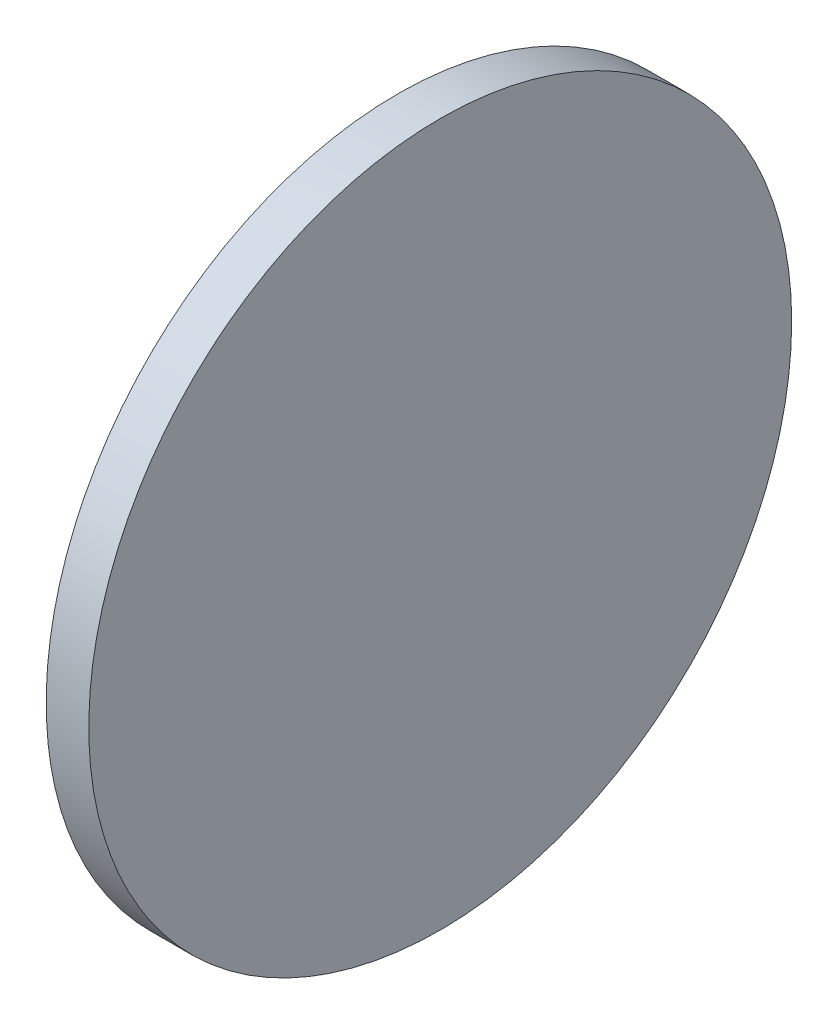
ISO-10303-21;
HEADER;
FILE_DESCRIPTION(('STEP AP214'),'2;1');
FILE_NAME('part.step','',(''),(''),'','','');
FILE_SCHEMA(('AUTOMOTIVE_DESIGN { 1 0 10303 214 1 1 1 1 }'));
ENDSEC;
DATA;
#1=APPLICATION_CONTEXT('core data for automotive mechanical design processes');
#2=APPLICATION_PROTOCOL_DEFINITION('international standard','automotive_design',2000,#1);
#3=PRODUCT_CONTEXT('',#1,'mechanical');
#4=PRODUCT('Part','Part','',(#3));
#5=PRODUCT_RELATED_PRODUCT_CATEGORY('part','',(#4));
#6=PRODUCT_DEFINITION_FORMATION('','',#4);
#7=PRODUCT_DEFINITION_CONTEXT('part definition',#1,'design');
#8=PRODUCT_DEFINITION('design','',#6,#7);
#9=PRODUCT_DEFINITION_SHAPE('','',#8);
#10=(LENGTH_UNIT() NAMED_UNIT(*) SI_UNIT(.MILLI.,.METRE.));
#11=(NAMED_UNIT(*) PLANE_ANGLE_UNIT() SI_UNIT($,.RADIAN.));
#12=(NAMED_UNIT(*) SI_UNIT($,.STERADIAN.) SOLID_ANGLE_UNIT());
#13=UNCERTAINTY_MEASURE_WITH_UNIT(LENGTH_MEASURE(1.E-05),#10,'distance_accuracy_value','');
#14=(GEOMETRIC_REPRESENTATION_CONTEXT(3) GLOBAL_UNCERTAINTY_ASSIGNED_CONTEXT((#13)) GLOBAL_UNIT_ASSIGNED_CONTEXT((#10,
#11,#12)) REPRESENTATION_CONTEXT('',''));
#15=CARTESIAN_POINT('',(0.,0.,0.));
#16=DIRECTION('',(0.,0.,1.));
#17=DIRECTION('',(1.,0.,0.));
#18=AXIS2_PLACEMENT_3D('',#15,#16,#17);
#19=CARTESIAN_POINT('',(376.792979828879,247.820822227896,369.071235745112));
#20=CARTESIAN_POINT('',(376.792979828879,249.16683202552,369.071235745112));
#21=CARTESIAN_POINT('',(376.792979828879,251.858851620768,369.336376532913));
#22=CARTESIAN_POINT('',(376.792979828879,255.741701808624,370.514226260344));
#23=CARTESIAN_POINT('',(376.792979828879,259.320157036274,372.426950429024));
#24=CARTESIAN_POINT('',(376.792979828879,262.456699276139,375.001044121819));
#25=CARTESIAN_POINT('',(376.792979828879,265.030792968934,378.137586361684));
#26=CARTESIAN_POINT('',(376.792979828879,266.943517137614,381.716041589333));
#27=CARTESIAN_POINT('',(376.792979828879,268.121366865045,385.59889177719));
#28=CARTESIAN_POINT('',(376.792979828879,268.519078046746,389.636921170062));
#29=CARTESIAN_POINT('',(376.792979828879,268.121366865045,393.674950562933));
#30=CARTESIAN_POINT('',(376.792979828879,266.943517137614,397.55780075079));
#31=CARTESIAN_POINT('',(376.792979828879,265.030792968934,401.136255978439));
#32=CARTESIAN_POINT('',(376.792979828879,262.456699276139,404.272798218304));
#33=CARTESIAN_POINT('',(376.792979828879,259.320157036274,406.846891911099));
#34=CARTESIAN_POINT('',(376.792979828879,255.741701808624,408.759616079779));
#35=CARTESIAN_POINT('',(376.792979828879,251.858851620768,409.93746580721));
#36=CARTESIAN_POINT('',(376.792979828879,247.820822227896,410.335176988911));
#37=CARTESIAN_POINT('',(376.792979828879,243.782792835025,409.93746580721));
#38=CARTESIAN_POINT('',(376.792979828879,239.899942647168,408.75961607978));
#39=CARTESIAN_POINT('',(376.792979828879,236.321487419519,406.846891911099));
#40=CARTESIAN_POINT('',(376.792979828879,233.184945179654,404.272798218304));
#41=CARTESIAN_POINT('',(376.792979828879,230.610851486859,401.136255978439));
#42=CARTESIAN_POINT('',(376.792979828879,228.698127318178,397.55780075079));
#43=CARTESIAN_POINT('',(376.792979828879,227.520277590748,393.674950562933));
#44=CARTESIAN_POINT('',(376.792979828879,227.122566409047,389.636921170061));
#45=CARTESIAN_POINT('',(376.792979828879,227.520277590748,385.59889177719));
#46=CARTESIAN_POINT('',(376.792979828879,228.698127318178,381.716041589333));
#47=CARTESIAN_POINT('',(376.792979828879,230.610851486859,378.137586361684));
#48=CARTESIAN_POINT('',(376.792979828879,233.184945179654,375.001044121819));
#49=CARTESIAN_POINT('',(376.792979828879,236.321487419519,372.426950429024));
#50=CARTESIAN_POINT('',(376.792979828879,239.899942647168,370.514226260344));
#51=CARTESIAN_POINT('',(376.792979828879,243.782792835025,369.336376532913));
#52=CARTESIAN_POINT('',(376.792979828879,246.474812430272,369.071235745112));
#53=CARTESIAN_POINT('',(376.792979828879,247.820822227896,369.071235745112));
#54=B_SPLINE_CURVE_WITH_KNOTS('',3,(#19,#20,#21,#22,#23,#24,#25,#26,#27,#28,#29,#30,#31,#32,#33,
#34,#35,#36,#37,#38,#39,#40,#41,#42,#43,#44,#45,#46,#47,#48,#49,#50,#51,#52,#53),.UNSPECIFIED.,
.T.,.F.,(4,1,1,1,1,1,1,1,1,1,1,1,1,1,1,1,1,1,1,1,1,1,1,1,1,1,1,1,1,1,1,1,4),(0.,
0.0312500000000002,0.0625000000000001,0.0937499999999997,0.125,0.15625,0.1875,0.21875,0.25,
0.28125,0.3125,0.34375,0.375,0.40625,0.4375,0.46875,0.5,0.53125,0.5625,0.59375,0.625,0.65625,
0.6875,0.71875,0.75,0.78125,0.8125,0.84375,0.875,0.90625,0.9375,0.96875,1.),.UNSPECIFIED.);
#55=DIRECTION('',(1.,0.,0.));
#56=VECTOR('',#55,1.);
#57=SURFACE_OF_LINEAR_EXTRUSION('',#54,#56);
#58=CARTESIAN_POINT('',(376.792979828879,247.820822227896,369.071235745112));
#59=CARTESIAN_POINT('',(376.792979828879,248.090025265433,369.071235758258));
#60=CARTESIAN_POINT('',(376.792979828879,248.359227126206,369.076538602103));
#61=CARTESIAN_POINT('',(376.792979828879,248.897217040621,369.097709095269));
#62=CARTESIAN_POINT('',(376.792979828879,249.166005091537,369.113576813913));
#63=CARTESIAN_POINT('',(376.792979828879,249.702753296032,369.155836271104));
#64=CARTESIAN_POINT('',(376.792979828879,249.97071344681,369.182228045224));
#65=CARTESIAN_POINT('',(376.792979828879,250.505392473979,369.245494954023));
#66=CARTESIAN_POINT('',(376.792979828879,250.772111354563,369.282370053265));
#67=CARTESIAN_POINT('',(376.792979828879,251.303894467433,369.366563035091));
#68=CARTESIAN_POINT('',(376.792979828879,251.568958710565,369.413880849151));
#69=CARTESIAN_POINT('',(376.792979828879,252.097018129299,369.518918398585));
#70=CARTESIAN_POINT('',(376.792979828879,252.3600133049,369.57663813396));
#71=CARTESIAN_POINT('',(376.792979828879,252.883536091862,369.702358545631));
#72=CARTESIAN_POINT('',(376.792979828879,253.14406368702,369.770359289386));
#73=CARTESIAN_POINT('',(376.792979828879,253.662253918709,369.916521102126));
#74=CARTESIAN_POINT('',(376.792979828879,253.919916545553,369.994682205454));
#75=CARTESIAN_POINT('',(376.792979828879,254.431979129106,370.161044167524));
#76=CARTESIAN_POINT('',(376.792979828879,254.686379096841,370.249244992326));
#77=CARTESIAN_POINT('',(376.792979828879,255.191518903522,370.435565966848));
#78=CARTESIAN_POINT('',(376.792979828879,255.442258766474,370.533686051475));
#79=CARTESIAN_POINT('',(376.792979828879,255.939679864039,370.739724616296));
#80=CARTESIAN_POINT('',(376.792979828879,256.186361098653,370.84764309649));
#81=CARTESIAN_POINT('',(376.792979828879,256.675297705972,371.073082054686));
#82=CARTESIAN_POINT('',(376.792979828879,256.917553049625,371.190602595691));
#83=CARTESIAN_POINT('',(376.792979828879,257.397271646333,371.435049849378));
#84=CARTESIAN_POINT('',(376.792979828879,257.634734883185,371.561976593854));
#85=CARTESIAN_POINT('',(376.792979828879,258.104502718993,371.825040411781));
#86=CARTESIAN_POINT('',(376.792979828879,258.336807335383,371.961177454096));
#87=CARTESIAN_POINT('',(376.792979828879,258.795891603413,372.242466210888));
#88=CARTESIAN_POINT('',(376.792979828879,259.022671291297,372.387617866206));
#89=CARTESIAN_POINT('',(376.792979828879,259.47033845199,372.686739499879));
#90=CARTESIAN_POINT('',(376.792979828879,259.691225924799,372.840709478234));
#91=CARTESIAN_POINT('',(376.792979828879,260.126786793359,373.15720349023));
#92=CARTESIAN_POINT('',(376.792979828879,260.341460148325,373.319727579995));
#93=CARTESIAN_POINT('',(376.792979828879,260.764271793273,373.653066303755));
#94=CARTESIAN_POINT('',(376.792979828879,260.972410061163,373.823880965772));
#95=CARTESIAN_POINT('',(376.792979828879,261.381830234779,374.173537244561));
#96=CARTESIAN_POINT('',(376.792979828879,261.583112163681,374.352378834199));
#97=CARTESIAN_POINT('',(376.792979828879,261.978498542088,374.717825604086));
#98=CARTESIAN_POINT('',(376.792979828879,262.172603038681,374.904430733384));
#99=CARTESIAN_POINT('',(376.792979828879,262.553312664573,375.285140359277));
#100=CARTESIAN_POINT('',(376.792979828879,262.739917793872,375.47924485587));
#101=CARTESIAN_POINT('',(376.792979828879,263.105364563759,375.874631234277));
#102=CARTESIAN_POINT('',(376.792979828879,263.284206153396,376.075913163178));
#103=CARTESIAN_POINT('',(376.792979828879,263.633862432186,376.485333336795));
#104=CARTESIAN_POINT('',(376.792979828879,263.804677094203,376.693471604685));
#105=CARTESIAN_POINT('',(376.792979828879,264.138015817963,377.116283249633));
#106=CARTESIAN_POINT('',(376.792979828879,264.300539907728,377.330956604599));
#107=CARTESIAN_POINT('',(376.792979828879,264.617033919724,377.766517473159));
#108=CARTESIAN_POINT('',(376.792979828879,264.771003898079,377.987404945968));
#109=CARTESIAN_POINT('',(376.792979828879,265.070125531752,378.435072106661));
#110=CARTESIAN_POINT('',(376.792979828879,265.21527718707,378.661851794545));
#111=CARTESIAN_POINT('',(376.792979828879,265.496565943862,379.120936062575));
#112=CARTESIAN_POINT('',(376.792979828879,265.632702986177,379.353240678965));
#113=CARTESIAN_POINT('',(376.792979828879,265.895766804104,379.823008514773));
#114=CARTESIAN_POINT('',(376.792979828879,266.02269354858,380.060471751625));
#115=CARTESIAN_POINT('',(376.792979828879,266.267140802267,380.540190348332));
#116=CARTESIAN_POINT('',(376.792979828879,266.384661343272,380.782445691985));
#117=CARTESIAN_POINT('',(376.792979828879,266.610100301468,381.271382299305));
#118=CARTESIAN_POINT('',(376.792979828879,266.718018781662,381.51806353392));
#119=CARTESIAN_POINT('',(376.792979828879,266.924057346483,382.015484631483));
#120=CARTESIAN_POINT('',(376.792979828879,267.02217743111,382.266224494431));
#121=CARTESIAN_POINT('',(376.792979828879,267.208498405632,382.771364301121));
#122=CARTESIAN_POINT('',(376.792979828879,267.296699230435,383.02576426887));
#123=CARTESIAN_POINT('',(376.792979828879,267.463061192503,383.537826852387));
#124=CARTESIAN_POINT('',(376.792979828879,267.541222295831,383.795489479182));
#125=CARTESIAN_POINT('',(376.792979828879,267.687384108573,384.313679711005));
#126=CARTESIAN_POINT('',(376.792979828879,267.755384852332,384.574207306347));
#127=CARTESIAN_POINT('',(376.792979828879,267.881105263993,385.097730092806));
#128=CARTESIAN_POINT('',(376.792979828879,267.938824999354,385.360725267721));
#129=CARTESIAN_POINT('',(376.792979828879,268.043862548825,385.888784688331));
#130=CARTESIAN_POINT('',(376.792979828879,268.091180362934,386.153848934027));
#131=CARTESIAN_POINT('',(376.792979828879,268.175373344625,386.685632039893));
#132=CARTESIAN_POINT('',(376.792979828879,268.212248443682,386.952350910908));
#133=CARTESIAN_POINT('',(376.792979828879,268.275515352987,387.487029964218));
#134=CARTESIAN_POINT('',(376.792979828879,268.301907127798,387.754990150706));
#135=CARTESIAN_POINT('',(376.792979828879,268.344166583101,388.291738257641));
#136=CARTESIAN_POINT('',(376.792979828879,268.360034299167,388.560526175289));
#137=CARTESIAN_POINT('',(376.792979828879,268.381204799377,389.098516453799));
#138=CARTESIAN_POINT('',(376.792979828879,268.386507652846,389.36771881193));
#139=CARTESIAN_POINT('',(376.792979828879,268.386507652846,389.906123528193));
#140=CARTESIAN_POINT('',(376.792979828879,268.381204799377,390.175325886324));
#141=CARTESIAN_POINT('',(376.792979828879,268.360034299167,390.713316164834));
#142=CARTESIAN_POINT('',(376.792979828879,268.344166583101,390.982104082481));
#143=CARTESIAN_POINT('',(376.792979828879,268.301907127798,391.518852189417));
#144=CARTESIAN_POINT('',(376.792979828879,268.275515352987,391.786812375905));
#145=CARTESIAN_POINT('',(376.792979828879,268.212248443682,392.321491429215));
#146=CARTESIAN_POINT('',(376.792979828879,268.175373344625,392.58821030023));
#147=CARTESIAN_POINT('',(376.792979828879,268.091180362934,393.119993406096));
#148=CARTESIAN_POINT('',(376.792979828879,268.043862548825,393.385057651792));
#149=CARTESIAN_POINT('',(376.792979828879,267.938824999354,393.913117072402));
#150=CARTESIAN_POINT('',(376.792979828879,267.881105263993,394.176112247317));
#151=CARTESIAN_POINT('',(376.792979828879,267.755384852332,394.699635033776));
#152=CARTESIAN_POINT('',(376.792979828879,267.687384108573,394.960162629118));
#153=CARTESIAN_POINT('',(376.792979828879,267.541222295831,395.478352860941));
#154=CARTESIAN_POINT('',(376.792979828879,267.463061192503,395.736015487736));
#155=CARTESIAN_POINT('',(376.792979828879,267.296699230435,396.248078071253));
#156=CARTESIAN_POINT('',(376.792979828879,267.208498405632,396.502478039002));
#157=CARTESIAN_POINT('',(376.792979828879,267.02217743111,397.007617845692));
#158=CARTESIAN_POINT('',(376.792979828879,266.924057346483,397.25835770864));
#159=CARTESIAN_POINT('',(376.792979828879,266.718018781662,397.755778806203));
#160=CARTESIAN_POINT('',(376.792979828879,266.610100301468,398.002460040818));
#161=CARTESIAN_POINT('',(376.792979828879,266.384661343272,398.491396648138));
#162=CARTESIAN_POINT('',(376.792979828879,266.267140802267,398.733651991791));
#163=CARTESIAN_POINT('',(376.792979828879,266.02269354858,399.213370588498));
#164=CARTESIAN_POINT('',(376.792979828879,265.895766804104,399.45083382535));
#165=CARTESIAN_POINT('',(376.792979828879,265.632702986177,399.920601661158));
#166=CARTESIAN_POINT('',(376.792979828879,265.496565943862,400.152906277548));
#167=CARTESIAN_POINT('',(376.792979828879,265.21527718707,400.611990545578));
#168=CARTESIAN_POINT('',(376.792979828879,265.070125531751,400.838770233462));
#169=CARTESIAN_POINT('',(376.792979828879,264.771003898078,401.286437394155));
#170=CARTESIAN_POINT('',(376.792979828879,264.617033919724,401.507324866964));
#171=CARTESIAN_POINT('',(376.792979828879,264.300539907728,401.942885735524));
#172=CARTESIAN_POINT('',(376.792979828879,264.138015817963,402.15755909049));
#173=CARTESIAN_POINT('',(376.792979828879,263.804677094203,402.580370735438));
#174=CARTESIAN_POINT('',(376.792979828879,263.633862432186,402.788509003328));
#175=CARTESIAN_POINT('',(376.792979828879,263.284206153397,403.197929176945));
#176=CARTESIAN_POINT('',(376.792979828879,263.105364563759,403.399211105846));
#177=CARTESIAN_POINT('',(376.792979828879,262.739917793872,403.794597484253));
#178=CARTESIAN_POINT('',(376.792979828879,262.553312664573,403.988701980846));
#179=CARTESIAN_POINT('',(376.792979828879,262.172603038681,404.369411606739));
#180=CARTESIAN_POINT('',(376.792979828879,261.978498542088,404.556016736037));
#181=CARTESIAN_POINT('',(376.792979828879,261.583112163681,404.921463505924));
#182=CARTESIAN_POINT('',(376.792979828879,261.38183023478,405.100305095562));
#183=CARTESIAN_POINT('',(376.792979828879,260.972410061163,405.449961374351));
#184=CARTESIAN_POINT('',(376.792979828879,260.764271793273,405.620776036368));
#185=CARTESIAN_POINT('',(376.792979828879,260.341460148325,405.954114760128));
#186=CARTESIAN_POINT('',(376.792979828879,260.126786793359,406.116638849893));
#187=CARTESIAN_POINT('',(376.792979828879,259.691225924799,406.43313286189));
#188=CARTESIAN_POINT('',(376.792979828879,259.47033845199,406.587102840244));
#189=CARTESIAN_POINT('',(376.792979828879,259.022671291297,406.886224473917));
#190=CARTESIAN_POINT('',(376.792979828879,258.795891603413,407.031376129235));
#191=CARTESIAN_POINT('',(376.792979828879,258.336807335383,407.312664886027));
#192=CARTESIAN_POINT('',(376.792979828879,258.104502718993,407.448801928342));
#193=CARTESIAN_POINT('',(376.792979828879,257.634734883185,407.711865746269));
#194=CARTESIAN_POINT('',(376.792979828879,257.397271646333,407.838792490745));
#195=CARTESIAN_POINT('',(376.792979828879,256.917553049625,408.083239744432));
#196=CARTESIAN_POINT('',(376.792979828879,256.675297705973,408.200760285437));
#197=CARTESIAN_POINT('',(376.792979828879,256.186361098653,408.426199243633));
#198=CARTESIAN_POINT('',(376.792979828879,255.939679864038,408.534117723827));
#199=CARTESIAN_POINT('',(376.792979828879,255.442258766475,408.740156288648));
#200=CARTESIAN_POINT('',(376.792979828879,255.191518903527,408.838276373275));
#201=CARTESIAN_POINT('',(376.792979828879,254.686379096837,409.024597347797));
#202=CARTESIAN_POINT('',(376.792979828879,254.431979129088,409.1127981726));
#203=CARTESIAN_POINT('',(376.792979828879,253.919916545571,409.279160134668));
#204=CARTESIAN_POINT('',(376.792979828879,253.662253918776,409.357321237996));
#205=CARTESIAN_POINT('',(376.792979828879,253.144063686953,409.503483050738));
#206=CARTESIAN_POINT('',(376.792979828879,252.883536091611,409.571483794497));
#207=CARTESIAN_POINT('',(376.792979828879,252.360013305152,409.697204206158));
#208=CARTESIAN_POINT('',(376.792979828879,252.097018130237,409.75492394152));
#209=CARTESIAN_POINT('',(376.792979828879,251.568958709627,409.85996149099));
#210=CARTESIAN_POINT('',(376.792979828879,251.303894463931,409.907279305099));
#211=CARTESIAN_POINT('',(376.792979828879,250.772111358065,409.99147228679));
#212=CARTESIAN_POINT('',(376.792979828879,250.50539248705,410.028347385847));
#213=CARTESIAN_POINT('',(376.792979828879,249.970713433739,410.091614295152));
#214=CARTESIAN_POINT('',(376.792979828879,249.702753247252,410.118006069963));
#215=CARTESIAN_POINT('',(376.792979828879,249.166005140316,410.160265525266));
#216=CARTESIAN_POINT('',(376.792979828879,248.897217222669,410.176133241332));
#217=CARTESIAN_POINT('',(376.792979828879,248.359226944159,410.197303741542));
#218=CARTESIAN_POINT('',(376.792979828879,248.090024586028,410.202606595011));
#219=CARTESIAN_POINT('',(376.792979828879,247.551619869765,410.202606595011));
#220=CARTESIAN_POINT('',(376.792979828879,247.282417511634,410.197303741542));
#221=CARTESIAN_POINT('',(376.792979828879,246.744427233124,410.176133241332));
#222=CARTESIAN_POINT('',(376.792979828879,246.475639315476,410.160265525266));
#223=CARTESIAN_POINT('',(376.792979828879,245.938891208541,410.118006069963));
#224=CARTESIAN_POINT('',(376.792979828879,245.670931022053,410.091614295152));
#225=CARTESIAN_POINT('',(376.792979828879,245.136251968743,410.028347385847));
#226=CARTESIAN_POINT('',(376.792979828879,244.869533097727,409.991472286791));
#227=CARTESIAN_POINT('',(376.792979828879,244.337749991862,409.9072793051));
#228=CARTESIAN_POINT('',(376.792979828879,244.072685746166,409.85996149099));
#229=CARTESIAN_POINT('',(376.792979828879,243.544626325556,409.75492394152));
#230=CARTESIAN_POINT('',(376.792979828879,243.281631150641,409.697204206158));
#231=CARTESIAN_POINT('',(376.792979828879,242.758108364182,409.571483794497));
#232=CARTESIAN_POINT('',(376.792979828879,242.49758076884,409.503483050738));
#233=CARTESIAN_POINT('',(376.792979828879,241.979390537017,409.357321237996));
#234=CARTESIAN_POINT('',(376.792979828879,241.721727910222,409.279160134668));
#235=CARTESIAN_POINT('',(376.792979828879,241.209665326705,409.1127981726));
#236=CARTESIAN_POINT('',(376.792979828879,240.955265358956,409.024597347797));
#237=CARTESIAN_POINT('',(376.792979828879,240.450125552266,408.838276373275));
#238=CARTESIAN_POINT('',(376.792979828879,240.199385689318,408.740156288648));
#239=CARTESIAN_POINT('',(376.792979828879,239.701964591755,408.534117723827));
#240=CARTESIAN_POINT('',(376.792979828879,239.45528335714,408.426199243633));
#241=CARTESIAN_POINT('',(376.792979828879,238.96634674982,408.200760285437));
#242=CARTESIAN_POINT('',(376.792979828879,238.724091406167,408.083239744432));
#243=CARTESIAN_POINT('',(376.792979828879,238.24437280946,407.838792490745));
#244=CARTESIAN_POINT('',(376.792979828879,238.006909572608,407.711865746269));
#245=CARTESIAN_POINT('',(376.792979828879,237.5371417368,407.448801928342));
#246=CARTESIAN_POINT('',(376.792979828879,237.30483712041,407.312664886027));
#247=CARTESIAN_POINT('',(376.792979828879,236.84575285238,407.031376129235));
#248=CARTESIAN_POINT('',(376.792979828879,236.618973164496,406.886224473917));
#249=CARTESIAN_POINT('',(376.792979828879,236.171306003803,406.587102840244));
#250=CARTESIAN_POINT('',(376.792979828879,235.950418530994,406.43313286189));
#251=CARTESIAN_POINT('',(376.792979828879,235.514857662434,406.116638849893));
#252=CARTESIAN_POINT('',(376.792979828879,235.300184307468,405.954114760128));
#253=CARTESIAN_POINT('',(376.792979828879,234.87737266252,405.620776036368));
#254=CARTESIAN_POINT('',(376.792979828879,234.66923439463,405.449961374351));
#255=CARTESIAN_POINT('',(376.792979828879,234.259814221013,405.100305095562));
#256=CARTESIAN_POINT('',(376.792979828879,234.058532292112,404.921463505924));
#257=CARTESIAN_POINT('',(376.792979828879,233.663145913705,404.556016736037));
#258=CARTESIAN_POINT('',(376.792979828879,233.469041417112,404.369411606739));
#259=CARTESIAN_POINT('',(376.792979828879,233.088331791219,403.988701980846));
#260=CARTESIAN_POINT('',(376.792979828879,232.90172666192,403.794597484253));
#261=CARTESIAN_POINT('',(376.792979828879,232.536279892033,403.399211105846));
#262=CARTESIAN_POINT('',(376.792979828879,232.357438302396,403.197929176945));
#263=CARTESIAN_POINT('',(376.792979828879,232.007782023607,402.788509003328));
#264=CARTESIAN_POINT('',(376.792979828879,231.83696736159,402.580370735438));
#265=CARTESIAN_POINT('',(376.792979828879,231.50362863783,402.15755909049));
#266=CARTESIAN_POINT('',(376.792979828879,231.341104548064,401.942885735524));
#267=CARTESIAN_POINT('',(376.792979828879,231.024610536068,401.507324866964));
#268=CARTESIAN_POINT('',(376.792979828879,230.870640557714,401.286437394155));
#269=CARTESIAN_POINT('',(376.792979828879,230.571518924041,400.838770233462));
#270=CARTESIAN_POINT('',(376.792979828879,230.426367268722,400.611990545578));
#271=CARTESIAN_POINT('',(376.792979828879,230.145078511931,400.152906277548));
#272=CARTESIAN_POINT('',(376.792979828879,230.008941469616,399.920601661158));
#273=CARTESIAN_POINT('',(376.792979828879,229.745877651689,399.45083382535));
#274=CARTESIAN_POINT('',(376.792979828879,229.618950907213,399.213370588498));
#275=CARTESIAN_POINT('',(376.792979828879,229.374503653526,398.733651991791));
#276=CARTESIAN_POINT('',(376.792979828879,229.256983112521,398.491396648138));
#277=CARTESIAN_POINT('',(376.792979828879,229.031544154325,398.002460040818));
#278=CARTESIAN_POINT('',(376.792979828879,228.923625674131,397.755778806203));
#279=CARTESIAN_POINT('',(376.792979828879,228.71758710931,397.25835770864));
#280=CARTESIAN_POINT('',(376.792979828879,228.619467024683,397.007617845692));
#281=CARTESIAN_POINT('',(376.792979828879,228.433146050161,396.502478039002));
#282=CARTESIAN_POINT('',(376.792979828879,228.344945225358,396.248078071253));
#283=CARTESIAN_POINT('',(376.792979828879,228.17858326329,395.736015487736));
#284=CARTESIAN_POINT('',(376.792979828879,228.100422159962,395.478352860941));
#285=CARTESIAN_POINT('',(376.792979828879,227.95426034722,394.960162629118));
#286=CARTESIAN_POINT('',(376.792979828879,227.886259603461,394.699635033776));
#287=CARTESIAN_POINT('',(376.792979828879,227.7605391918,394.176112247317));
#288=CARTESIAN_POINT('',(376.792979828879,227.702819456438,393.913117072402));
#289=CARTESIAN_POINT('',(376.792979828879,227.597781906968,393.385057651792));
#290=CARTESIAN_POINT('',(376.792979828879,227.550464092858,393.119993406096));
#291=CARTESIAN_POINT('',(376.792979828879,227.466271111167,392.588210300231));
#292=CARTESIAN_POINT('',(376.792979828879,227.429396012111,392.321491429215));
#293=CARTESIAN_POINT('',(376.792979828879,227.366129102806,391.786812375905));
#294=CARTESIAN_POINT('',(376.792979828879,227.339737327995,391.518852189417));
#295=CARTESIAN_POINT('',(376.792979828879,227.297477872692,390.982104082482));
#296=CARTESIAN_POINT('',(376.792979828879,227.281610156626,390.713316164834));
#297=CARTESIAN_POINT('',(376.792979828879,227.260439656416,390.175325886324));
#298=CARTESIAN_POINT('',(376.792979828879,227.255136802947,389.906123528193));
#299=CARTESIAN_POINT('',(376.792979828879,227.255136802947,389.36771881193));
#300=CARTESIAN_POINT('',(376.792979828879,227.260439656416,389.098516453799));
#301=CARTESIAN_POINT('',(376.792979828879,227.281610156626,388.560526175289));
#302=CARTESIAN_POINT('',(376.792979828879,227.297477872692,388.291738257641));
#303=CARTESIAN_POINT('',(376.792979828879,227.339737327995,387.754990150706));
#304=CARTESIAN_POINT('',(376.792979828879,227.366129102806,387.487029964218));
#305=CARTESIAN_POINT('',(376.792979828879,227.429396012111,386.952350910908));
#306=CARTESIAN_POINT('',(376.792979828879,227.466271111167,386.685632039893));
#307=CARTESIAN_POINT('',(376.792979828879,227.550464092858,386.153848934027));
#308=CARTESIAN_POINT('',(376.792979828879,227.597781906968,385.888784688331));
#309=CARTESIAN_POINT('',(376.792979828879,227.702819456438,385.360725267721));
#310=CARTESIAN_POINT('',(376.792979828879,227.7605391918,385.097730092806));
#311=CARTESIAN_POINT('',(376.792979828879,227.886259603461,384.574207306347));
#312=CARTESIAN_POINT('',(376.792979828879,227.95426034722,384.313679711005));
#313=CARTESIAN_POINT('',(376.792979828879,228.100422159962,383.795489479182));
#314=CARTESIAN_POINT('',(376.792979828879,228.17858326329,383.537826852387));
#315=CARTESIAN_POINT('',(376.792979828879,228.344945225358,383.02576426887));
#316=CARTESIAN_POINT('',(376.792979828879,228.433146050161,382.771364301121));
#317=CARTESIAN_POINT('',(376.792979828879,228.619467024683,382.266224494431));
#318=CARTESIAN_POINT('',(376.792979828879,228.71758710931,382.015484631483));
#319=CARTESIAN_POINT('',(376.792979828879,228.923625674131,381.51806353392));
#320=CARTESIAN_POINT('',(376.792979828879,229.031544154325,381.271382299305));
#321=CARTESIAN_POINT('',(376.792979828879,229.256983112521,380.782445691985));
#322=CARTESIAN_POINT('',(376.792979828879,229.374503653526,380.540190348332));
#323=CARTESIAN_POINT('',(376.792979828879,229.618950907212,380.060471751625));
#324=CARTESIAN_POINT('',(376.792979828879,229.745877651689,379.823008514773));
#325=CARTESIAN_POINT('',(376.792979828879,230.008941469616,379.353240678965));
#326=CARTESIAN_POINT('',(376.792979828879,230.14507851193,379.120936062575));
#327=CARTESIAN_POINT('',(376.792979828879,230.426367268722,378.661851794545));
#328=CARTESIAN_POINT('',(376.792979828879,230.571518924041,378.435072106661));
#329=CARTESIAN_POINT('',(376.792979828879,230.870640557714,377.987404945968));
#330=CARTESIAN_POINT('',(376.792979828879,231.024610536068,377.766517473159));
#331=CARTESIAN_POINT('',(376.792979828879,231.341104548064,377.330956604599));
#332=CARTESIAN_POINT('',(376.792979828879,231.50362863783,377.116283249633));
#333=CARTESIAN_POINT('',(376.792979828879,231.83696736159,376.693471604685));
#334=CARTESIAN_POINT('',(376.792979828879,232.007782023607,376.485333336795));
#335=CARTESIAN_POINT('',(376.792979828879,232.357438302396,376.075913163178));
#336=CARTESIAN_POINT('',(376.792979828879,232.536279892034,375.874631234277));
#337=CARTESIAN_POINT('',(376.792979828879,232.90172666192,375.47924485587));
#338=CARTESIAN_POINT('',(376.792979828879,233.088331791219,375.285140359277));
#339=CARTESIAN_POINT('',(376.792979828879,233.469041417112,374.904430733384));
#340=CARTESIAN_POINT('',(376.792979828879,233.663145913705,374.717825604086));
#341=CARTESIAN_POINT('',(376.792979828879,234.058532292112,374.352378834199));
#342=CARTESIAN_POINT('',(376.792979828879,234.259814221013,374.173537244561));
#343=CARTESIAN_POINT('',(376.792979828879,234.66923439463,373.823880965772));
#344=CARTESIAN_POINT('',(376.792979828879,234.87737266252,373.653066303755));
#345=CARTESIAN_POINT('',(376.792979828879,235.300184307468,373.319727579995));
#346=CARTESIAN_POINT('',(376.792979828879,235.514857662434,373.15720349023));
#347=CARTESIAN_POINT('',(376.792979828879,235.950418530994,372.840709478234));
#348=CARTESIAN_POINT('',(376.792979828879,236.171306003803,372.686739499879));
#349=CARTESIAN_POINT('',(376.792979828879,236.618973164496,372.387617866206));
#350=CARTESIAN_POINT('',(376.792979828879,236.84575285238,372.242466210888));
#351=CARTESIAN_POINT('',(376.792979828879,237.30483712041,371.961177454096));
#352=CARTESIAN_POINT('',(376.792979828879,237.5371417368,371.825040411781));
#353=CARTESIAN_POINT('',(376.792979828879,238.006909572607,371.561976593854));
#354=CARTESIAN_POINT('',(376.792979828879,238.24437280946,371.435049849378));
#355=CARTESIAN_POINT('',(376.792979828879,238.724091406167,371.190602595691));
#356=CARTESIAN_POINT('',(376.792979828879,238.96634674982,371.073082054686));
#357=CARTESIAN_POINT('',(376.792979828879,239.45528335714,370.84764309649));
#358=CARTESIAN_POINT('',(376.792979828879,239.701964591753,370.739724616296));
#359=CARTESIAN_POINT('',(376.792979828879,240.199385689319,370.533686051475));
#360=CARTESIAN_POINT('',(376.792979828879,240.45012555227,370.435565966848));
#361=CARTESIAN_POINT('',(376.792979828879,240.955265358951,370.249244992326));
#362=CARTESIAN_POINT('',(376.792979828879,241.209665326687,370.161044167524));
#363=CARTESIAN_POINT('',(376.792979828879,241.72172791024,369.994682205454));
#364=CARTESIAN_POINT('',(376.792979828879,241.979390537084,369.916521102126));
#365=CARTESIAN_POINT('',(376.792979828879,242.497580768773,369.770359289386));
#366=CARTESIAN_POINT('',(376.792979828879,242.75810836393,369.702358545631));
#367=CARTESIAN_POINT('',(376.792979828879,243.281631150893,369.57663813396));
#368=CARTESIAN_POINT('',(376.792979828879,243.544626326494,369.518918398585));
#369=CARTESIAN_POINT('',(376.792979828879,244.072685745227,369.413880849151));
#370=CARTESIAN_POINT('',(376.792979828879,244.337749988359,369.366563035091));
#371=CARTESIAN_POINT('',(376.792979828879,244.86953310123,369.282370053265));
#372=CARTESIAN_POINT('',(376.792979828879,245.136251981814,369.245494954023));
#373=CARTESIAN_POINT('',(376.792979828879,245.670931008983,369.182228045224));
#374=CARTESIAN_POINT('',(376.792979828879,245.938891159761,369.155836271104));
#375=CARTESIAN_POINT('',(376.792979828879,246.475639364256,369.113576813913));
#376=CARTESIAN_POINT('',(376.792979828879,246.744427415171,369.097709095269));
#377=CARTESIAN_POINT('',(376.792979828879,247.282417329587,369.076538602103));
#378=CARTESIAN_POINT('',(376.792979828879,247.55161919036,369.071235758258));
#379=CARTESIAN_POINT('',(376.792979828879,247.820822227896,369.071235745112));
#380=B_SPLINE_CURVE_WITH_KNOTS('',3,(#58,#59,#60,#61,#62,#63,#64,#65,#66,#67,#68,#69,#70,#71,
#72,#73,#74,#75,#76,#77,#78,#79,#80,#81,#82,#83,#84,#85,#86,#87,#88,#89,#90,#91,#92,#93,#94,#95,
#96,#97,#98,#99,#100,#101,#102,#103,#104,#105,#106,#107,#108,#109,#110,#111,#112,#113,#114,#115,
#116,#117,#118,#119,#120,#121,#122,#123,#124,#125,#126,#127,#128,#129,#130,#131,#132,#133,#134,
#135,#136,#137,#138,#139,#140,#141,#142,#143,#144,#145,#146,#147,#148,#149,#150,#151,#152,#153,
#154,#155,#156,#157,#158,#159,#160,#161,#162,#163,#164,#165,#166,#167,#168,#169,#170,#171,#172,
#173,#174,#175,#176,#177,#178,#179,#180,#181,#182,#183,#184,#185,#186,#187,#188,#189,#190,#191,
#192,#193,#194,#195,#196,#197,#198,#199,#200,#201,#202,#203,#204,#205,#206,#207,#208,#209,#210,
#211,#212,#213,#214,#215,#216,#217,#218,#219,#220,#221,#222,#223,#224,#225,#226,#227,#228,#229,
#230,#231,#232,#233,#234,#235,#236,#237,#238,#239,#240,#241,#242,#243,#244,#245,#246,#247,#248,
#249,#250,#251,#252,#253,#254,#255,#256,#257,#258,#259,#260,#261,#262,#263,#264,#265,#266,#267,
#268,#269,#270,#271,#272,#273,#274,#275,#276,#277,#278,#279,#280,#281,#282,#283,#284,#285,#286,
#287,#288,#289,#290,#291,#292,#293,#294,#295,#296,#297,#298,#299,#300,#301,#302,#303,#304,#305,
#306,#307,#308,#309,#310,#311,#312,#313,#314,#315,#316,#317,#318,#319,#320,#321,#322,#323,#324,
#325,#326,#327,#328,#329,#330,#331,#332,#333,#334,#335,#336,#337,#338,#339,#340,#341,#342,#343,
#344,#345,#346,#347,#348,#349,#350,#351,#352,#353,#354,#355,#356,#357,#358,#359,#360,#361,#362,
#363,#364,#365,#366,#367,#368,#369,#370,#371,#372,#373,#374,#375,#376,#377,#378,#379),
.UNSPECIFIED.,.F.,.F.,(4,2,2,2,2,2,2,2,2,2,2,2,2,2,2,2,2,2,2,2,2,2,2,2,2,2,2,2,2,2,2,2,2,2,2,2,
2,2,2,2,2,2,2,2,2,2,2,2,2,2,2,2,2,2,2,2,2,2,2,2,2,2,2,2,2,2,2,2,2,2,2,2,2,2,2,2,2,2,2,2,2,2,2,2,
2,2,2,2,2,2,2,2,2,2,2,2,2,2,2,2,2,2,2,2,2,2,2,2,2,2,2,2,2,2,2,2,2,2,2,2,2,2,2,2,2,2,2,2,2,2,2,2,
2,2,2,2,2,2,2,2,2,2,2,2,2,2,2,2,2,2,2,2,2,2,2,2,2,2,2,2,4),(0.,0.807555281253712,
1.61511586156481,2.42267917167975,3.23023975199085,4.03779503324463,4.84535031449834,
5.65291089480939,6.46047420492439,7.26803478523554,8.07559006648928,8.88314534774301,
9.69070592805421,10.4982692381692,11.3058298184803,12.1133850997339,12.9209403809877,
13.7285009612988,14.5360642714137,15.3436248517248,16.1511801329785,16.9587354142324,
17.7662959945434,18.5738593046584,19.3814198849695,20.1889751662234,20.996530447477,
21.8040910277881,22.6116543379032,23.4192149182142,24.2267701994679,25.0343254807217,
25.8418860610328,26.6494493711478,27.4570099514588,28.2645652327126,29.0721205139663,
29.8796810942775,30.6872444043924,31.4948049847035,32.3023602659573,33.109915547211,
33.9174761275221,34.7250394376371,35.5326000179482,36.340155299202,37.1477105804557,
37.9552711607668,38.7628344708818,39.5703950511929,40.3779503324467,41.1855056137004,
41.9930661940115,42.8006295041265,43.6081900844377,44.4157453656913,45.2233006469451,
46.0308612272562,46.8384245373711,47.6459851176823,48.4535403989359,49.2610956801897,
50.0686562605008,50.8762195706158,51.6837801509269,52.4913354321806,53.2988907134344,
54.1064512937455,54.9140146038605,55.7215751841715,56.5291304654253,57.336685746679,
58.1442463269901,58.9518096371052,59.7593702174162,60.56692549867,61.3744807799237,
62.1820413602348,62.9896046703498,63.7971652506609,64.6047205319146,65.4122758131684,
66.2198363934795,67.0273997035945,67.8349602839055,68.6425155651592,69.450070846413,
70.2576314267241,71.0651947368391,71.8727553171502,72.6803105984038,73.4878658796576,
74.2954264599687,75.1029897700837,75.9105503503949,76.7181056316487,77.5256609129024,
78.3332214932135,79.1407848033285,79.9483453836395,80.7559006648933,81.5634559461471,
82.3710165264581,83.1785798365731,83.9861404168842,84.793695698138,85.6012509793916,
86.4088115597027,87.2163748698178,88.0239354501289,88.8314907313826,89.6390460126363,
90.4466065929475,91.2541699030624,92.0617304833735,92.8692857646273,93.676841045881,
94.4844016261921,95.2919649363072,96.0995255166182,96.907080797872,97.7146360791257,
98.5221966594368,99.3297599695518,100.137320549863,100.944875831117,101.75243111237,
102.559991692681,103.367555002796,104.175115583108,104.982670864361,105.790226145615,
106.597786725926,107.405350036041,108.212910616352,109.020465897606,109.82802117886,
110.635581759171,111.443145069286,112.250705649597,113.058260930851,113.865816212104,
114.673376792415,115.48094010253,116.288500682841,117.096055964095,117.903611245349,
118.71117182566,119.518735135775,120.326295716086,121.13385099734,121.941406278594,
122.748966858905,123.55653016902,124.364090749331,125.171646030585,125.979201311838,
126.786761892149,127.594325202264,128.401885782576,129.209441063829),.UNSPECIFIED.);
#381=CARTESIAN_POINT('',(376.792979828879,247.820822227896,369.071235745112));
#382=VERTEX_POINT('',#381);
#383=EDGE_CURVE('E9',#382,#382,#380,.T.);
#384=ORIENTED_EDGE('',*,*,#383,.T.);
#385=EDGE_LOOP('',(#384));
#386=FACE_BOUND('',#385,.T.);
#387=CARTESIAN_POINT('',(379.284804762537,247.820822227896,369.071235745112));
#388=CARTESIAN_POINT('',(379.284804762537,247.49451495975,369.071235961153));
#389=CARTESIAN_POINT('',(379.284804762537,247.168209865213,369.079027009905));
#390=CARTESIAN_POINT('',(379.284804762537,246.516336621732,369.11011860062));
#391=CARTESIAN_POINT('',(379.284804762537,246.190768478437,369.133419261068));
#392=CARTESIAN_POINT('',(379.284804762537,245.541106539136,369.195457920313));
#393=CARTESIAN_POINT('',(379.284804762537,245.21701274406,369.234195928843));
#394=CARTESIAN_POINT('',(379.284804762537,244.571034544479,369.327034728814));
#395=CARTESIAN_POINT('',(379.284804762537,244.249150123764,369.381135407424));
#396=CARTESIAN_POINT('',(379.284804762537,243.608330211076,369.504635986474));
#397=CARTESIAN_POINT('',(379.284804762537,243.289394714028,369.574035860579));
#398=CARTESIAN_POINT('',(379.284804762537,242.655185426737,369.727932512786));
#399=CARTESIAN_POINT('',(379.284804762537,242.339911664619,369.812429406759));
#400=CARTESIAN_POINT('',(379.284804762537,241.713732996334,369.996302730044));
#401=CARTESIAN_POINT('',(379.284804762537,241.402828098366,370.095679187273));
#402=CARTESIAN_POINT('',(379.284804762537,240.786093665247,370.309094638198));
#403=CARTESIAN_POINT('',(379.284804762537,240.480264095482,370.423133531848));
#404=CARTESIAN_POINT('',(379.284804762537,239.874394524628,370.665671844156));
#405=CARTESIAN_POINT('',(379.284804762537,239.574354504206,370.794171214517));
#406=CARTESIAN_POINT('',(379.284804762537,238.980730752569,371.065309087617));
#407=CARTESIAN_POINT('',(379.284804762537,238.687147069252,371.207947695206));
#408=CARTESIAN_POINT('',(379.284804762537,238.107085626148,371.507009054397));
#409=CARTESIAN_POINT('',(379.284804762537,237.820607888228,371.66343184841));
#410=CARTESIAN_POINT('',(379.284804762537,237.255409184225,371.989711538643));
#411=CARTESIAN_POINT('',(379.284804762537,236.976688170797,372.159568352839));
#412=CARTESIAN_POINT('',(379.284804762537,236.427664356189,372.512379910978));
#413=CARTESIAN_POINT('',(379.284804762537,236.157361514851,372.695334592425));
#414=CARTESIAN_POINT('',(379.284804762537,235.625776655882,373.073913219307));
#415=CARTESIAN_POINT('',(379.284804762537,235.36449469998,373.269537251412));
#416=CARTESIAN_POINT('',(379.284804762537,234.8515173637,373.67297621099));
#417=CARTESIAN_POINT('',(379.284804762537,234.59982202361,373.880791189685));
#418=CARTESIAN_POINT('',(379.284804762537,234.106588768772,374.308142774532));
#419=CARTESIAN_POINT('',(379.284804762537,233.865050800994,374.527679319474));
#420=CARTESIAN_POINT('',(379.284804762537,233.39271426119,374.97801456741));
#421=CARTESIAN_POINT('',(379.284804762537,233.161915625244,375.208813203355));
#422=CARTESIAN_POINT('',(379.284804762537,232.711580377309,375.681149743159));
#423=CARTESIAN_POINT('',(379.284804762537,232.492043832367,375.922687710937));
#424=CARTESIAN_POINT('',(379.284804762537,232.06469224752,376.415920965775));
#425=CARTESIAN_POINT('',(379.284804762537,231.856877268825,376.667616305865));
#426=CARTESIAN_POINT('',(379.284804762537,231.453438309247,377.180593642145));
#427=CARTESIAN_POINT('',(379.284804762537,231.257814277142,377.441875598047));
#428=CARTESIAN_POINT('',(379.284804762537,230.879235650259,377.973460457017));
#429=CARTESIAN_POINT('',(379.284804762537,230.696280968813,378.243763298355));
#430=CARTESIAN_POINT('',(379.284804762537,230.343469410673,378.792787112962));
#431=CARTESIAN_POINT('',(379.284804762537,230.173612596478,379.07150812639));
#432=CARTESIAN_POINT('',(379.284804762537,229.847332906245,379.636706830394));
#433=CARTESIAN_POINT('',(379.284804762537,229.690910112232,379.923184568315));
#434=CARTESIAN_POINT('',(379.284804762537,229.391848753042,380.503246011415));
#435=CARTESIAN_POINT('',(379.284804762537,229.249210145453,380.796829694725));
#436=CARTESIAN_POINT('',(379.284804762537,228.97807227235,381.39045344638));
#437=CARTESIAN_POINT('',(379.284804762537,228.849572901985,381.690493466827));
#438=CARTESIAN_POINT('',(379.284804762537,228.607034589688,382.296363037614));
#439=CARTESIAN_POINT('',(379.284804762537,228.492995696054,382.602192607288));
#440=CARTESIAN_POINT('',(379.284804762537,228.279580245087,383.218927040655));
#441=CARTESIAN_POINT('',(379.284804762537,228.180203787799,383.529831938964));
#442=CARTESIAN_POINT('',(379.284804762537,227.996330464674,384.15601060632));
#443=CARTESIAN_POINT('',(379.284804762537,227.911833570919,384.471284367169));
#444=CARTESIAN_POINT('',(379.284804762537,227.757936918116,385.105493657926));
#445=CARTESIAN_POINT('',(379.284804762537,227.688537043196,385.42442915971));
#446=CARTESIAN_POINT('',(379.284804762537,227.565036466372,386.065249059461));
#447=CARTESIAN_POINT('',(379.284804762537,227.510935790805,386.387133462502));
#448=CARTESIAN_POINT('',(379.284804762537,227.418096982522,387.033111710368));
#449=CARTESIAN_POINT('',(379.284804762537,227.379358962637,387.357205571402));
#450=CARTESIAN_POINT('',(379.284804762537,227.317320334414,388.006867330501));
#451=CARTESIAN_POINT('',(379.284804762537,227.294019716344,388.332435227635));
#452=CARTESIAN_POINT('',(379.284804762537,227.262928009852,388.984309143639));
#453=CARTESIAN_POINT('',(379.284804762537,227.255136802947,389.31061515685));
#454=CARTESIAN_POINT('',(379.284804762537,227.255136802947,389.963227183273));
#455=CARTESIAN_POINT('',(379.284804762537,227.262928009852,390.289533196484));
#456=CARTESIAN_POINT('',(379.284804762537,227.294019716343,390.941407112488));
#457=CARTESIAN_POINT('',(379.284804762537,227.317320334414,391.266975009622));
#458=CARTESIAN_POINT('',(379.284804762537,227.379358962637,391.916636768721));
#459=CARTESIAN_POINT('',(379.284804762537,227.418096982522,392.240730629755));
#460=CARTESIAN_POINT('',(379.284804762537,227.510935790805,392.886708877622));
#461=CARTESIAN_POINT('',(379.284804762537,227.565036466372,393.208593280663));
#462=CARTESIAN_POINT('',(379.284804762537,227.688537043195,393.849413180413));
#463=CARTESIAN_POINT('',(379.284804762537,227.757936918116,394.168348682197));
#464=CARTESIAN_POINT('',(379.284804762537,227.911833570919,394.802557972954));
#465=CARTESIAN_POINT('',(379.284804762537,227.996330464674,395.117831733803));
#466=CARTESIAN_POINT('',(379.284804762537,228.180203787799,395.744010401159));
#467=CARTESIAN_POINT('',(379.284804762537,228.279580245087,396.054915299468));
#468=CARTESIAN_POINT('',(379.284804762537,228.492995696054,396.671649732836));
#469=CARTESIAN_POINT('',(379.284804762537,228.607034589688,396.977479302509));
#470=CARTESIAN_POINT('',(379.284804762537,228.849572901985,397.583348873296));
#471=CARTESIAN_POINT('',(379.284804762537,228.97807227235,397.883388893743));
#472=CARTESIAN_POINT('',(379.284804762537,229.249210145454,398.477012645398));
#473=CARTESIAN_POINT('',(379.284804762537,229.391848753042,398.770596328708));
#474=CARTESIAN_POINT('',(379.284804762537,229.690910112232,399.350657771808));
#475=CARTESIAN_POINT('',(379.284804762537,229.847332906245,399.637135509729));
#476=CARTESIAN_POINT('',(379.284804762537,230.173612596478,400.202334213733));
#477=CARTESIAN_POINT('',(379.284804762537,230.343469410673,400.481055227162));
#478=CARTESIAN_POINT('',(379.284804762537,230.696280968813,401.030079041768));
#479=CARTESIAN_POINT('',(379.284804762537,230.879235650259,401.300381883106));
#480=CARTESIAN_POINT('',(379.284804762537,231.257814277142,401.831966742076));
#481=CARTESIAN_POINT('',(379.284804762537,231.453438309247,402.093248697978));
#482=CARTESIAN_POINT('',(379.284804762537,231.856877268825,402.606226034258));
#483=CARTESIAN_POINT('',(379.284804762537,232.06469224752,402.857921374348));
#484=CARTESIAN_POINT('',(379.284804762537,232.492043832367,403.351154629186));
#485=CARTESIAN_POINT('',(379.284804762537,232.711580377309,403.592692596964));
#486=CARTESIAN_POINT('',(379.284804762537,233.161915625244,404.065029136768));
#487=CARTESIAN_POINT('',(379.284804762537,233.39271426119,404.295827772714));
#488=CARTESIAN_POINT('',(379.284804762537,233.865050800994,404.746163020649));
#489=CARTESIAN_POINT('',(379.284804762537,234.106588768772,404.965699565591));
#490=CARTESIAN_POINT('',(379.284804762537,234.59982202361,405.393051150438));
#491=CARTESIAN_POINT('',(379.284804762537,234.8515173637,405.600866129133));
#492=CARTESIAN_POINT('',(379.284804762537,235.36449469998,406.004305088711));
#493=CARTESIAN_POINT('',(379.284804762537,235.625776655882,406.199929120816));
#494=CARTESIAN_POINT('',(379.284804762537,236.157361514852,406.578507747699));
#495=CARTESIAN_POINT('',(379.284804762537,236.42766435619,406.761462429145));
#496=CARTESIAN_POINT('',(379.284804762537,236.976688170796,407.114273987284));
#497=CARTESIAN_POINT('',(379.284804762537,237.255409184225,407.28413080148));
#498=CARTESIAN_POINT('',(379.284804762537,237.820607888229,407.610410491713));
#499=CARTESIAN_POINT('',(379.284804762537,238.10708562615,407.766833285726));
#500=CARTESIAN_POINT('',(379.284804762537,238.68714706925,408.065894644916));
#501=CARTESIAN_POINT('',(379.284804762537,238.98073075256,408.208533252504));
#502=CARTESIAN_POINT('',(379.284804762537,239.574354504215,408.479671125608));
#503=CARTESIAN_POINT('',(379.284804762537,239.874394524661,408.608170495973));
#504=CARTESIAN_POINT('',(379.284804762537,240.480264095449,408.85070880827));
#505=CARTESIAN_POINT('',(379.284804762537,240.786093665122,408.964747701904));
#506=CARTESIAN_POINT('',(379.284804762537,241.40282809849,409.178163152871));
#507=CARTESIAN_POINT('',(379.284804762537,241.713732996799,409.277539610159));
#508=CARTESIAN_POINT('',(379.284804762537,242.339911664155,409.461412933284));
#509=CARTESIAN_POINT('',(379.284804762537,242.655185425004,409.545909827039));
#510=CARTESIAN_POINT('',(379.284804762537,243.289394715761,409.699806479842));
#511=CARTESIAN_POINT('',(379.284804762537,243.608330217545,409.769206354763));
#512=CARTESIAN_POINT('',(379.284804762537,244.249150117295,409.892706931586));
#513=CARTESIAN_POINT('',(379.284804762537,244.571034520336,409.946807607152));
#514=CARTESIAN_POINT('',(379.284804762537,245.217012768203,410.039646415436));
#515=CARTESIAN_POINT('',(379.284804762537,245.541106629237,410.078384435321));
#516=CARTESIAN_POINT('',(379.284804762537,246.190768388336,410.140423063544));
#517=CARTESIAN_POINT('',(379.284804762537,246.51633628547,410.163723681614));
#518=CARTESIAN_POINT('',(379.284804762537,247.168210201473,410.194815388106));
#519=CARTESIAN_POINT('',(379.284804762537,247.494516214685,410.202606595011));
#520=CARTESIAN_POINT('',(379.284804762537,248.147128241108,410.202606595011));
#521=CARTESIAN_POINT('',(379.284804762537,248.473434254319,410.194815388106));
#522=CARTESIAN_POINT('',(379.284804762537,249.125308170323,410.163723681614));
#523=CARTESIAN_POINT('',(379.284804762537,249.450876067457,410.140423063544));
#524=CARTESIAN_POINT('',(379.284804762537,250.100537826555,410.078384435321));
#525=CARTESIAN_POINT('',(379.284804762537,250.42463168759,410.039646415436));
#526=CARTESIAN_POINT('',(379.284804762537,251.070609935456,409.946807607152));
#527=CARTESIAN_POINT('',(379.284804762537,251.392494338497,409.892706931586));
#528=CARTESIAN_POINT('',(379.284804762537,252.033314238247,409.769206354762));
#529=CARTESIAN_POINT('',(379.284804762537,252.352249740032,409.699806479842));
#530=CARTESIAN_POINT('',(379.284804762537,252.986459030789,409.545909827039));
#531=CARTESIAN_POINT('',(379.284804762537,253.301732791638,409.461412933284));
#532=CARTESIAN_POINT('',(379.284804762537,253.927911458994,409.277539610159));
#533=CARTESIAN_POINT('',(379.284804762537,254.238816357302,409.178163152871));
#534=CARTESIAN_POINT('',(379.284804762537,254.85555079067,408.964747701904));
#535=CARTESIAN_POINT('',(379.284804762537,255.161380360344,408.850708808269));
#536=CARTESIAN_POINT('',(379.284804762537,255.767249931131,408.608170495973));
#537=CARTESIAN_POINT('',(379.284804762537,256.067289951578,408.479671125608));
#538=CARTESIAN_POINT('',(379.284804762537,256.660913703233,408.208533252504));
#539=CARTESIAN_POINT('',(379.284804762537,256.954497386543,408.065894644916));
#540=CARTESIAN_POINT('',(379.284804762537,257.534558829642,407.766833285726));
#541=CARTESIAN_POINT('',(379.284804762537,257.821036567564,407.610410491713));
#542=CARTESIAN_POINT('',(379.284804762537,258.386235271568,407.28413080148));
#543=CARTESIAN_POINT('',(379.284804762537,258.664956284996,407.114273987284));
#544=CARTESIAN_POINT('',(379.284804762537,259.213980099603,406.761462429145));
#545=CARTESIAN_POINT('',(379.284804762537,259.484282940941,406.578507747699));
#546=CARTESIAN_POINT('',(379.284804762537,260.015867799911,406.199929120816));
#547=CARTESIAN_POINT('',(379.284804762537,260.277149755813,406.004305088711));
#548=CARTESIAN_POINT('',(379.284804762537,260.790127092093,405.600866129133));
#549=CARTESIAN_POINT('',(379.284804762537,261.041822432183,405.393051150438));
#550=CARTESIAN_POINT('',(379.284804762537,261.535055687021,404.965699565591));
#551=CARTESIAN_POINT('',(379.284804762537,261.776593654799,404.746163020649));
#552=CARTESIAN_POINT('',(379.284804762537,262.248930194603,404.295827772714));
#553=CARTESIAN_POINT('',(379.284804762537,262.479728830548,404.065029136768));
#554=CARTESIAN_POINT('',(379.284804762537,262.930064078484,403.592692596964));
#555=CARTESIAN_POINT('',(379.284804762537,263.149600623425,403.351154629186));
#556=CARTESIAN_POINT('',(379.284804762537,263.576952208273,402.857921374348));
#557=CARTESIAN_POINT('',(379.284804762537,263.784767186968,402.606226034258));
#558=CARTESIAN_POINT('',(379.284804762537,264.188206146545,402.093248697978));
#559=CARTESIAN_POINT('',(379.284804762537,264.383830178651,401.831966742076));
#560=CARTESIAN_POINT('',(379.284804762537,264.762408805533,401.300381883106));
#561=CARTESIAN_POINT('',(379.284804762537,264.94536348698,401.030079041768));
#562=CARTESIAN_POINT('',(379.284804762537,265.298175045119,400.481055227162));
#563=CARTESIAN_POINT('',(379.284804762537,265.468031859315,400.202334213733));
#564=CARTESIAN_POINT('',(379.284804762537,265.794311549547,399.637135509729));
#565=CARTESIAN_POINT('',(379.284804762537,265.950734343561,399.350657771808));
#566=CARTESIAN_POINT('',(379.284804762537,266.249795702751,398.770596328708));
#567=CARTESIAN_POINT('',(379.284804762537,266.392434310339,398.477012645398));
#568=CARTESIAN_POINT('',(379.284804762537,266.663572183443,397.883388893743));
#569=CARTESIAN_POINT('',(379.284804762537,266.792071553808,397.583348873297));
#570=CARTESIAN_POINT('',(379.284804762537,267.034609866104,396.977479302509));
#571=CARTESIAN_POINT('',(379.284804762537,267.148648759739,396.671649732836));
#572=CARTESIAN_POINT('',(379.284804762537,267.362064210706,396.054915299468));
#573=CARTESIAN_POINT('',(379.284804762537,267.461440667994,395.744010401159));
#574=CARTESIAN_POINT('',(379.284804762537,267.645313991119,395.117831733803));
#575=CARTESIAN_POINT('',(379.284804762537,267.729810884874,394.802557972954));
#576=CARTESIAN_POINT('',(379.284804762537,267.883707537677,394.168348682197));
#577=CARTESIAN_POINT('',(379.284804762537,267.953107412597,393.849413180413));
#578=CARTESIAN_POINT('',(379.284804762537,268.07660798942,393.208593280662));
#579=CARTESIAN_POINT('',(379.284804762537,268.130708664987,392.886708877621));
#580=CARTESIAN_POINT('',(379.284804762537,268.223547473271,392.240730629755));
#581=CARTESIAN_POINT('',(379.284804762537,268.262285493156,391.916636768721));
#582=CARTESIAN_POINT('',(379.284804762537,268.324324121379,391.266975009622));
#583=CARTESIAN_POINT('',(379.284804762537,268.347624739449,390.941407112488));
#584=CARTESIAN_POINT('',(379.284804762537,268.378716445941,390.289533196484));
#585=CARTESIAN_POINT('',(379.284804762537,268.386507652846,389.963227183273));
#586=CARTESIAN_POINT('',(379.284804762537,268.386507652846,389.31061515685));
#587=CARTESIAN_POINT('',(379.284804762537,268.378716445941,388.984309143639));
#588=CARTESIAN_POINT('',(379.284804762537,268.347624739449,388.332435227635));
#589=CARTESIAN_POINT('',(379.284804762537,268.324324121379,388.006867330501));
#590=CARTESIAN_POINT('',(379.284804762537,268.262285493156,387.357205571402));
#591=CARTESIAN_POINT('',(379.284804762537,268.223547473271,387.033111710368));
#592=CARTESIAN_POINT('',(379.284804762537,268.130708664987,386.387133462502));
#593=CARTESIAN_POINT('',(379.284804762537,268.07660798942,386.065249059461));
#594=CARTESIAN_POINT('',(379.284804762537,267.953107412597,385.42442915971));
#595=CARTESIAN_POINT('',(379.284804762537,267.883707537677,385.105493657926));
#596=CARTESIAN_POINT('',(379.284804762537,267.729810884874,384.471284367169));
#597=CARTESIAN_POINT('',(379.284804762537,267.645313991119,384.15601060632));
#598=CARTESIAN_POINT('',(379.284804762537,267.461440667994,383.529831938964));
#599=CARTESIAN_POINT('',(379.284804762537,267.362064210706,383.218927040655));
#600=CARTESIAN_POINT('',(379.284804762537,267.148648759739,382.602192607288));
#601=CARTESIAN_POINT('',(379.284804762537,267.034609866104,382.296363037614));
#602=CARTESIAN_POINT('',(379.284804762537,266.792071553808,381.690493466827));
#603=CARTESIAN_POINT('',(379.284804762537,266.663572183442,381.39045344638));
#604=CARTESIAN_POINT('',(379.284804762537,266.392434310339,380.796829694725));
#605=CARTESIAN_POINT('',(379.284804762537,266.249795702751,380.503246011415));
#606=CARTESIAN_POINT('',(379.284804762537,265.950734343561,379.923184568315));
#607=CARTESIAN_POINT('',(379.284804762537,265.794311549547,379.636706830394));
#608=CARTESIAN_POINT('',(379.284804762537,265.468031859315,379.07150812639));
#609=CARTESIAN_POINT('',(379.284804762537,265.298175045119,378.792787112962));
#610=CARTESIAN_POINT('',(379.284804762537,264.945363486979,378.243763298355));
#611=CARTESIAN_POINT('',(379.284804762537,264.762408805533,377.973460457017));
#612=CARTESIAN_POINT('',(379.284804762537,264.383830178651,377.441875598047));
#613=CARTESIAN_POINT('',(379.284804762537,264.188206146545,377.180593642145));
#614=CARTESIAN_POINT('',(379.284804762537,263.784767186968,376.667616305865));
#615=CARTESIAN_POINT('',(379.284804762537,263.576952208273,376.415920965775));
#616=CARTESIAN_POINT('',(379.284804762537,263.149600623425,375.922687710937));
#617=CARTESIAN_POINT('',(379.284804762537,262.930064078484,375.681149743159));
#618=CARTESIAN_POINT('',(379.284804762537,262.479728830548,375.208813203355));
#619=CARTESIAN_POINT('',(379.284804762537,262.248930194603,374.97801456741));
#620=CARTESIAN_POINT('',(379.284804762537,261.776593654799,374.527679319474));
#621=CARTESIAN_POINT('',(379.284804762537,261.535055687021,374.308142774532));
#622=CARTESIAN_POINT('',(379.284804762537,261.041822432183,373.880791189685));
#623=CARTESIAN_POINT('',(379.284804762537,260.790127092093,373.67297621099));
#624=CARTESIAN_POINT('',(379.284804762537,260.277149755813,373.269537251412));
#625=CARTESIAN_POINT('',(379.284804762537,260.015867799911,373.073913219307));
#626=CARTESIAN_POINT('',(379.284804762537,259.484282940941,372.695334592424));
#627=CARTESIAN_POINT('',(379.284804762537,259.213980099603,372.512379910978));
#628=CARTESIAN_POINT('',(379.284804762537,258.664956284996,372.159568352838));
#629=CARTESIAN_POINT('',(379.284804762537,258.386235271567,371.989711538643));
#630=CARTESIAN_POINT('',(379.284804762537,257.821036567565,371.66343184841));
#631=CARTESIAN_POINT('',(379.284804762537,257.534558829645,371.507009054397));
#632=CARTESIAN_POINT('',(379.284804762537,256.954497386541,371.207947695206));
#633=CARTESIAN_POINT('',(379.284804762537,256.660913703224,371.065309087617));
#634=CARTESIAN_POINT('',(379.284804762537,256.067289951587,370.794171214517));
#635=CARTESIAN_POINT('',(379.284804762537,255.767249931165,370.665671844156));
#636=CARTESIAN_POINT('',(379.284804762537,255.16138036031,370.423133531848));
#637=CARTESIAN_POINT('',(379.284804762537,254.855550790546,370.309094638198));
#638=CARTESIAN_POINT('',(379.284804762537,254.238816357427,370.095679187273));
#639=CARTESIAN_POINT('',(379.284804762537,253.927911459458,369.996302730044));
#640=CARTESIAN_POINT('',(379.284804762537,253.301732791174,369.812429406759));
#641=CARTESIAN_POINT('',(379.284804762537,252.986459029056,369.727932512786));
#642=CARTESIAN_POINT('',(379.284804762537,252.352249741765,369.57403586058));
#643=CARTESIAN_POINT('',(379.284804762537,252.033314244716,369.504635986474));
#644=CARTESIAN_POINT('',(379.284804762537,251.392494332028,369.381135407424));
#645=CARTESIAN_POINT('',(379.284804762537,251.070609911314,369.327034728814));
#646=CARTESIAN_POINT('',(379.284804762537,250.424631711733,369.234195928843));
#647=CARTESIAN_POINT('',(379.284804762537,250.100537916657,369.195457920313));
#648=CARTESIAN_POINT('',(379.284804762537,249.450875977356,369.133419261068));
#649=CARTESIAN_POINT('',(379.284804762537,249.12530783406,369.11011860062));
#650=CARTESIAN_POINT('',(379.284804762537,248.473434590579,369.079027009905));
#651=CARTESIAN_POINT('',(379.284804762537,248.147129496043,369.071235961154));
#652=CARTESIAN_POINT('',(379.284804762537,247.820822227896,369.071235745112));
#653=B_SPLINE_CURVE_WITH_KNOTS('',3,(#387,#388,#389,#390,#391,#392,#393,#394,#395,#396,#397,
#398,#399,#400,#401,#402,#403,#404,#405,#406,#407,#408,#409,#410,#411,#412,#413,#414,#415,#416,
#417,#418,#419,#420,#421,#422,#423,#424,#425,#426,#427,#428,#429,#430,#431,#432,#433,#434,#435,
#436,#437,#438,#439,#440,#441,#442,#443,#444,#445,#446,#447,#448,#449,#450,#451,#452,#453,#454,
#455,#456,#457,#458,#459,#460,#461,#462,#463,#464,#465,#466,#467,#468,#469,#470,#471,#472,#473,
#474,#475,#476,#477,#478,#479,#480,#481,#482,#483,#484,#485,#486,#487,#488,#489,#490,#491,#492,
#493,#494,#495,#496,#497,#498,#499,#500,#501,#502,#503,#504,#505,#506,#507,#508,#509,#510,#511,
#512,#513,#514,#515,#516,#517,#518,#519,#520,#521,#522,#523,#524,#525,#526,#527,#528,#529,#530,
#531,#532,#533,#534,#535,#536,#537,#538,#539,#540,#541,#542,#543,#544,#545,#546,#547,#548,#549,
#550,#551,#552,#553,#554,#555,#556,#557,#558,#559,#560,#561,#562,#563,#564,#565,#566,#567,#568,
#569,#570,#571,#572,#573,#574,#575,#576,#577,#578,#579,#580,#581,#582,#583,#584,#585,#586,#587,
#588,#589,#590,#591,#592,#593,#594,#595,#596,#597,#598,#599,#600,#601,#602,#603,#604,#605,#606,
#607,#608,#609,#610,#611,#612,#613,#614,#615,#616,#617,#618,#619,#620,#621,#622,#623,#624,#625,
#626,#627,#628,#629,#630,#631,#632,#633,#634,#635,#636,#637,#638,#639,#640,#641,#642,#643,#644,
#645,#646,#647,#648,#649,#650,#651,#652),.UNSPECIFIED.,.F.,.F.,(4,2,2,2,2,2,2,2,2,2,2,2,2,2,2,2,
2,2,2,2,2,2,2,2,2,2,2,2,2,2,2,2,2,2,2,2,2,2,2,2,2,2,2,2,2,2,2,2,2,2,2,2,2,2,2,2,2,2,2,2,2,2,2,2,
2,2,2,2,2,2,2,2,2,2,2,2,2,2,2,2,2,2,2,2,2,2,2,2,2,2,2,2,2,2,2,2,2,2,2,2,2,2,2,2,2,2,2,2,2,2,2,2,
2,2,2,2,2,2,2,2,2,2,2,2,2,2,2,2,2,2,2,2,4),(0.,0.978825977356078,1.95765943246797,
2.93649350470554,3.91532038806143,4.89414558648635,5.87297829788741,6.85181284589416,
7.83064071546761,8.8094653159554,9.78829717552481,10.7671320468658,11.7459609422522,
12.724785167351,13.7036160891251,14.6824511239794,15.6612810478448,16.6401051450424,
17.6189350689078,18.5977701037621,19.5766010255362,20.555425250635,21.5342541460214,
22.5130890173622,23.4919208769317,24.4707454774195,25.4495733469929,26.4284078949997,
27.4072406064008,28.3860658048257,29.3648926881815,30.3437267604191,31.322560215531,
32.3013861928871,33.2802121702431,34.259045625355,35.2378796975926,36.2167065809485,
37.1955317793734,38.1743644907744,39.1531990387812,40.1320269083546,41.1108515088424,
42.0896833684119,43.0685182397528,44.0473471351392,45.0261713602379,46.0050022820121,
46.9838373168665,47.9626672407318,48.9414913379294,49.9203212617947,50.8991562966491,
51.8779872184232,52.856811443522,53.8356403389084,54.8144752102493,55.7933070698188,
56.7721316703066,57.75095953988,58.7297940878867,59.7086267992878,60.6874519977127,
61.6662788810685,62.6451129533061,63.623946408418,64.6027723857741,65.5815983631301,
66.560431818242,67.5392658904796,68.5180927738354,69.4969179722604,70.4757506836614,
71.4545852316682,72.4334131012416,73.4122377017294,74.3910695612989,75.3699044326398,
76.3487333280261,77.3275575531249,78.306388474899,79.2852235097534,80.2640534336188,
81.2428775308164,82.2217074546817,83.2005424895361,84.1793734113102,85.158197636409,
86.1370265317954,87.1158614031363,88.0946932627057,89.0735178631935,90.0523457327669,
91.0311802807738,92.0100129921749,92.9888381905998,93.9676650739556,94.9464991461932,
95.9253326013051,96.9041585786612,97.8829845560172,98.8618180111291,99.8406520833667,
100.819478966722,101.798304165147,102.777136876549,103.755971424555,104.734799294129,
105.713623894617,106.692455754186,107.671290625527,108.650119520913,109.628943746012,
110.607774667786,111.586609702641,112.565439626506,113.544263723703,114.523093647569,
115.501928682423,116.480759604197,117.459583829296,118.438412724683,119.417247596023,
120.396079455593,121.374904056081,122.353731925654,123.332566473661,124.311399185062,
125.290224383487,126.269051266843,127.24788533908,128.226718794192,129.205544771548),.UNSPECIFIED.);
#654=CARTESIAN_POINT('',(379.284804762537,247.820822227896,369.071235745112));
#655=VERTEX_POINT('',#654);
#656=EDGE_CURVE('E24',#655,#655,#653,.F.);
#657=ORIENTED_EDGE('',*,*,#656,.F.);
#658=EDGE_LOOP('',(#657));
#659=FACE_BOUND('',#658,.T.);
#660=ADVANCED_FACE('F14',(#386,#659),#57,.T.);
#661=CARTESIAN_POINT('',(376.79297982888,247.120822227896,223.186921170062));
#662=DIRECTION('',(1.,0.,0.));
#663=DIRECTION('',(0.,1.,0.));
#664=AXIS2_PLACEMENT_3D('',#661,#662,#663);
#665=PLANE('',#664);
#666=ORIENTED_EDGE('',*,*,#383,.F.);
#667=EDGE_LOOP('',(#666));
#668=FACE_BOUND('',#667,.T.);
#669=ADVANCED_FACE('F62',(#668),#665,.F.);
#670=CARTESIAN_POINT('',(379.284804762538,247.120822227896,223.186921170062));
#671=DIRECTION('',(1.,0.,0.));
#672=DIRECTION('',(0.,1.,0.));
#673=AXIS2_PLACEMENT_3D('',#670,#671,#672);
#674=PLANE('',#673);
#675=ORIENTED_EDGE('',*,*,#656,.T.);
#676=EDGE_LOOP('',(#675));
#677=FACE_BOUND('',#676,.T.);
#678=ADVANCED_FACE('F31',(#677),#674,.T.);
#679=CLOSED_SHELL('',(#660,#669,#678));
#680=MANIFOLD_SOLID_BREP('B1',#679);
#681=ADVANCED_BREP_SHAPE_REPRESENTATION('',(#18,#680),#14);
#682=SHAPE_DEFINITION_REPRESENTATION(#9,#681);
ENDSEC;
END-ISO-10303-21;
